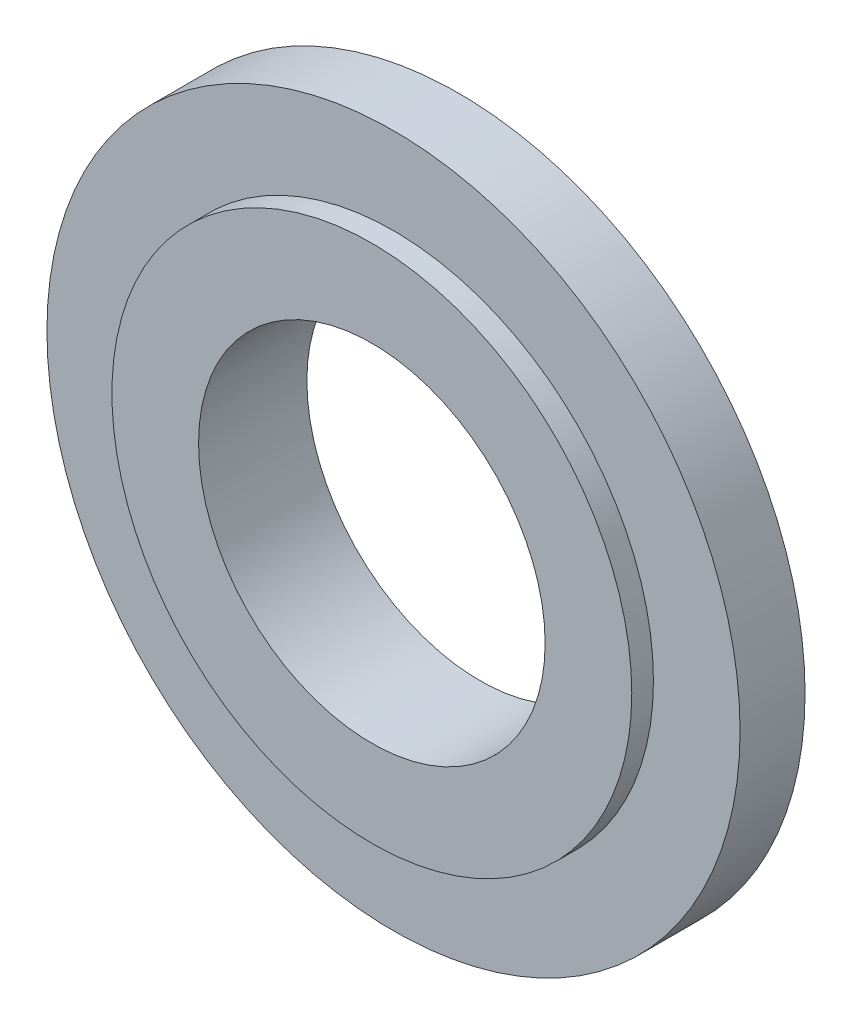
ISO-10303-21;
HEADER;
FILE_DESCRIPTION(('STEP AP214'),'2;1');
FILE_NAME('part.step','',(''),(''),'','','');
FILE_SCHEMA(('AUTOMOTIVE_DESIGN { 1 0 10303 214 1 1 1 1 }'));
ENDSEC;
DATA;
#1=APPLICATION_CONTEXT('core data for automotive mechanical design processes');
#2=APPLICATION_PROTOCOL_DEFINITION('international standard','automotive_design',2000,#1);
#3=PRODUCT_CONTEXT('',#1,'mechanical');
#4=PRODUCT('Part','Part','',(#3));
#5=PRODUCT_RELATED_PRODUCT_CATEGORY('part','',(#4));
#6=PRODUCT_DEFINITION_FORMATION('','',#4);
#7=PRODUCT_DEFINITION_CONTEXT('part definition',#1,'design');
#8=PRODUCT_DEFINITION('design','',#6,#7);
#9=PRODUCT_DEFINITION_SHAPE('','',#8);
#10=(LENGTH_UNIT() NAMED_UNIT(*) SI_UNIT(.MILLI.,.METRE.));
#11=(NAMED_UNIT(*) PLANE_ANGLE_UNIT() SI_UNIT($,.RADIAN.));
#12=(NAMED_UNIT(*) SI_UNIT($,.STERADIAN.) SOLID_ANGLE_UNIT());
#13=UNCERTAINTY_MEASURE_WITH_UNIT(LENGTH_MEASURE(1.E-05),#10,'distance_accuracy_value','');
#14=(GEOMETRIC_REPRESENTATION_CONTEXT(3) GLOBAL_UNCERTAINTY_ASSIGNED_CONTEXT((#13)) GLOBAL_UNIT_ASSIGNED_CONTEXT((#10,
#11,#12)) REPRESENTATION_CONTEXT('',''));
#15=CARTESIAN_POINT('',(0.,0.,0.));
#16=DIRECTION('',(0.,0.,1.));
#17=DIRECTION('',(1.,0.,0.));
#18=AXIS2_PLACEMENT_3D('',#15,#16,#17);
#19=CARTESIAN_POINT('',(0.,0.,0.));
#20=DIRECTION('',(0.,0.,1.));
#21=DIRECTION('',(1.,0.,0.));
#22=AXIS2_PLACEMENT_3D('',#19,#20,#21);
#23=PLANE('',#22);
#24=CARTESIAN_POINT('',(0.,0.,0.));
#25=DIRECTION('',(0.,0.,1.));
#26=DIRECTION('',(1.,0.,0.));
#27=AXIS2_PLACEMENT_3D('',#24,#25,#26);
#28=CIRCLE('',#27,8.);
#29=CARTESIAN_POINT('',(8.,0.,0.));
#30=VERTEX_POINT('',#29);
#31=EDGE_CURVE('E44',#30,#30,#28,.T.);
#32=ORIENTED_EDGE('',*,*,#31,.F.);
#33=EDGE_LOOP('',(#32));
#34=FACE_BOUND('',#33,.T.);
#35=CARTESIAN_POINT('',(0.,0.,0.));
#36=DIRECTION('',(0.,0.,1.));
#37=DIRECTION('',(1.,0.,0.));
#38=AXIS2_PLACEMENT_3D('',#35,#36,#37);
#39=CIRCLE('',#38,6.);
#40=CARTESIAN_POINT('',(6.,0.,0.));
#41=VERTEX_POINT('',#40);
#42=EDGE_CURVE('E10',#41,#41,#39,.F.);
#43=ORIENTED_EDGE('',*,*,#42,.F.);
#44=EDGE_LOOP('',(#43));
#45=FACE_BOUND('',#44,.T.);
#46=ADVANCED_FACE('F33',(#34,#45),#23,.F.);
#47=CARTESIAN_POINT('',(0.,0.,1.5));
#48=DIRECTION('',(0.,0.,1.));
#49=DIRECTION('',(1.,0.,0.));
#50=AXIS2_PLACEMENT_3D('',#47,#48,#49);
#51=PLANE('',#50);
#52=CARTESIAN_POINT('',(0.,0.,1.5));
#53=DIRECTION('',(0.,0.,1.));
#54=DIRECTION('',(1.,0.,0.));
#55=AXIS2_PLACEMENT_3D('',#52,#53,#54);
#56=CIRCLE('',#55,8.);
#57=CARTESIAN_POINT('',(8.,0.,1.5));
#58=VERTEX_POINT('',#57);
#59=EDGE_CURVE('E40',#58,#58,#56,.T.);
#60=ORIENTED_EDGE('',*,*,#59,.T.);
#61=EDGE_LOOP('',(#60));
#62=FACE_BOUND('',#61,.T.);
#63=CARTESIAN_POINT('',(0.,0.,1.5));
#64=DIRECTION('',(0.,0.,1.));
#65=DIRECTION('',(1.,0.,0.));
#66=AXIS2_PLACEMENT_3D('',#63,#64,#65);
#67=CIRCLE('',#66,6.);
#68=CARTESIAN_POINT('',(6.,0.,1.5));
#69=VERTEX_POINT('',#68);
#70=EDGE_CURVE('E51',#69,#69,#67,.T.);
#71=ORIENTED_EDGE('',*,*,#70,.F.);
#72=EDGE_LOOP('',(#71));
#73=FACE_BOUND('',#72,.T.);
#74=ADVANCED_FACE('F84',(#62,#73),#51,.T.);
#75=CARTESIAN_POINT('',(0.,0.,1.5));
#76=DIRECTION('',(0.,0.,-1.));
#77=DIRECTION('',(-1.,0.,0.));
#78=AXIS2_PLACEMENT_3D('',#75,#76,#77);
#79=CYLINDRICAL_SURFACE('',#78,8.);
#80=ORIENTED_EDGE('',*,*,#59,.F.);
#81=EDGE_LOOP('',(#80));
#82=FACE_BOUND('',#81,.T.);
#83=ORIENTED_EDGE('',*,*,#31,.T.);
#84=EDGE_LOOP('',(#83));
#85=FACE_BOUND('',#84,.T.);
#86=ADVANCED_FACE('F35',(#82,#85),#79,.T.);
#87=CARTESIAN_POINT('',(0.,0.,1.5));
#88=DIRECTION('',(0.,0.,-1.));
#89=DIRECTION('',(-1.,0.,0.));
#90=AXIS2_PLACEMENT_3D('',#87,#88,#89);
#91=CYLINDRICAL_SURFACE('',#90,4.);
#92=CARTESIAN_POINT('',(0.,0.,2.));
#93=DIRECTION('',(0.,0.,1.));
#94=DIRECTION('',(1.,0.,0.));
#95=AXIS2_PLACEMENT_3D('',#92,#93,#94);
#96=CIRCLE('',#95,4.);
#97=CARTESIAN_POINT('',(4.,0.,2.));
#98=VERTEX_POINT('',#97);
#99=EDGE_CURVE('E54',#98,#98,#96,.T.);
#100=ORIENTED_EDGE('',*,*,#99,.T.);
#101=EDGE_LOOP('',(#100));
#102=FACE_BOUND('',#101,.T.);
#103=CARTESIAN_POINT('',(0.,0.,-0.5));
#104=DIRECTION('',(0.,0.,-1.));
#105=DIRECTION('',(-1.,0.,0.));
#106=AXIS2_PLACEMENT_3D('',#103,#104,#105);
#107=CIRCLE('',#106,4.);
#108=CARTESIAN_POINT('',(-4.,0.,-0.5));
#109=VERTEX_POINT('',#108);
#110=EDGE_CURVE('E62',#109,#109,#107,.T.);
#111=ORIENTED_EDGE('',*,*,#110,.T.);
#112=EDGE_LOOP('',(#111));
#113=FACE_BOUND('',#112,.T.);
#114=ADVANCED_FACE('F66',(#102,#113),#91,.F.);
#115=CARTESIAN_POINT('',(0.,0.,2.));
#116=DIRECTION('',(0.,0.,1.));
#117=DIRECTION('',(1.,0.,0.));
#118=AXIS2_PLACEMENT_3D('',#115,#116,#117);
#119=PLANE('',#118);
#120=CARTESIAN_POINT('',(0.,0.,2.));
#121=DIRECTION('',(0.,0.,1.));
#122=DIRECTION('',(1.,0.,0.));
#123=AXIS2_PLACEMENT_3D('',#120,#121,#122);
#124=CIRCLE('',#123,6.);
#125=CARTESIAN_POINT('',(6.,0.,2.));
#126=VERTEX_POINT('',#125);
#127=EDGE_CURVE('E49',#126,#126,#124,.T.);
#128=ORIENTED_EDGE('',*,*,#127,.T.);
#129=EDGE_LOOP('',(#128));
#130=FACE_BOUND('',#129,.T.);
#131=ORIENTED_EDGE('',*,*,#99,.F.);
#132=EDGE_LOOP('',(#131));
#133=FACE_BOUND('',#132,.T.);
#134=ADVANCED_FACE('F80',(#130,#133),#119,.T.);
#135=CARTESIAN_POINT('',(0.,0.,2.));
#136=DIRECTION('',(0.,0.,-1.));
#137=DIRECTION('',(-1.,0.,0.));
#138=AXIS2_PLACEMENT_3D('',#135,#136,#137);
#139=CYLINDRICAL_SURFACE('',#138,6.);
#140=ORIENTED_EDGE('',*,*,#127,.F.);
#141=EDGE_LOOP('',(#140));
#142=FACE_BOUND('',#141,.T.);
#143=ORIENTED_EDGE('',*,*,#70,.T.);
#144=EDGE_LOOP('',(#143));
#145=FACE_BOUND('',#144,.T.);
#146=ADVANCED_FACE('F71',(#142,#145),#139,.T.);
#147=CARTESIAN_POINT('',(0.,0.,-0.5));
#148=DIRECTION('',(0.,0.,-1.));
#149=DIRECTION('',(-1.,0.,0.));
#150=AXIS2_PLACEMENT_3D('',#147,#148,#149);
#151=PLANE('',#150);
#152=CARTESIAN_POINT('',(0.,0.,-0.5));
#153=DIRECTION('',(0.,0.,-1.));
#154=DIRECTION('',(-1.,0.,0.));
#155=AXIS2_PLACEMENT_3D('',#152,#153,#154);
#156=CIRCLE('',#155,6.);
#157=CARTESIAN_POINT('',(-6.,0.,-0.5));
#158=VERTEX_POINT('',#157);
#159=EDGE_CURVE('E59',#158,#158,#156,.T.);
#160=ORIENTED_EDGE('',*,*,#159,.T.);
#161=EDGE_LOOP('',(#160));
#162=FACE_BOUND('',#161,.T.);
#163=ORIENTED_EDGE('',*,*,#110,.F.);
#164=EDGE_LOOP('',(#163));
#165=FACE_BOUND('',#164,.T.);
#166=ADVANCED_FACE('F68',(#162,#165),#151,.T.);
#167=CARTESIAN_POINT('',(0.,0.,-0.5));
#168=DIRECTION('',(0.,0.,1.));
#169=DIRECTION('',(1.,0.,0.));
#170=AXIS2_PLACEMENT_3D('',#167,#168,#169);
#171=CYLINDRICAL_SURFACE('',#170,6.);
#172=ORIENTED_EDGE('',*,*,#159,.F.);
#173=EDGE_LOOP('',(#172));
#174=FACE_BOUND('',#173,.T.);
#175=ORIENTED_EDGE('',*,*,#42,.T.);
#176=EDGE_LOOP('',(#175));
#177=FACE_BOUND('',#176,.T.);
#178=ADVANCED_FACE('F70',(#174,#177),#171,.T.);
#179=CLOSED_SHELL('',(#46,#74,#86,#114,#134,#146,#166,#178));
#180=MANIFOLD_SOLID_BREP('B2',#179);
#181=ADVANCED_BREP_SHAPE_REPRESENTATION('',(#18,#180),#14);
#182=SHAPE_DEFINITION_REPRESENTATION(#9,#181);
ENDSEC;
END-ISO-10303-21;
